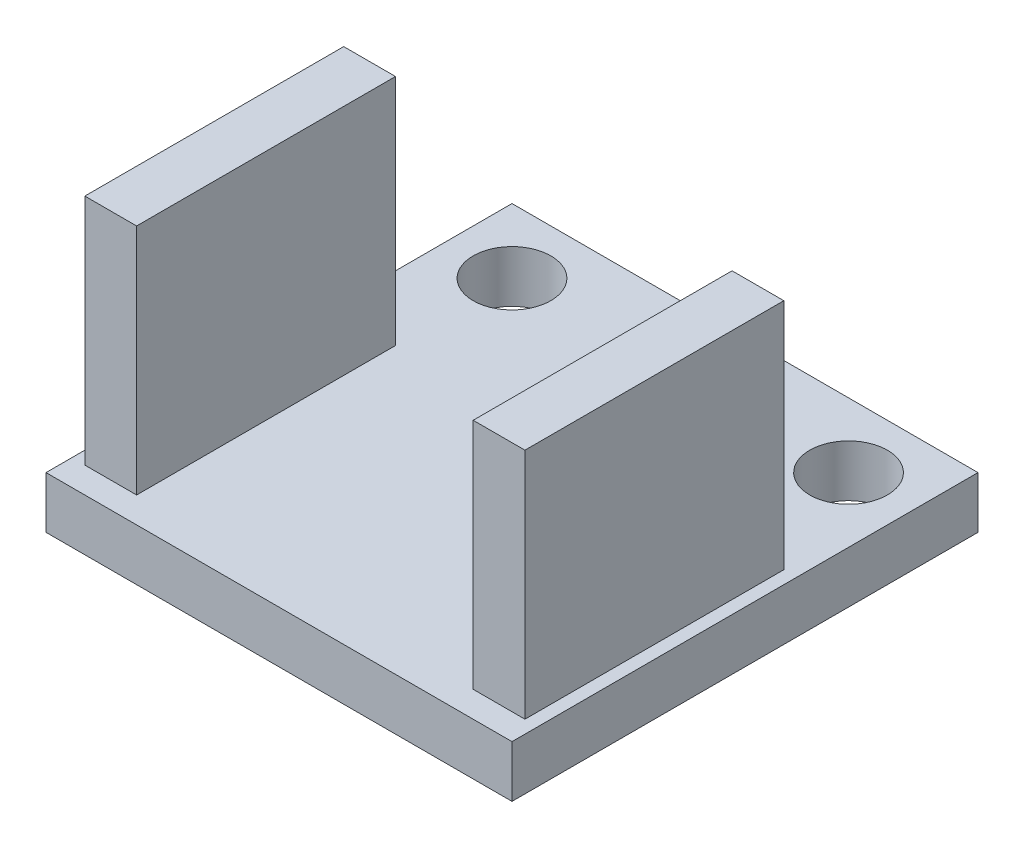
ISO-10303-21;
HEADER;
FILE_DESCRIPTION(('STEP AP214'),'2;1');
FILE_NAME('part.step','',(''),(''),'','','');
FILE_SCHEMA(('AUTOMOTIVE_DESIGN { 1 0 10303 214 1 1 1 1 }'));
ENDSEC;
DATA;
#1=APPLICATION_CONTEXT('core data for automotive mechanical design processes');
#2=APPLICATION_PROTOCOL_DEFINITION('international standard','automotive_design',2000,#1);
#3=PRODUCT_CONTEXT('',#1,'mechanical');
#4=PRODUCT('Part','Part','',(#3));
#5=PRODUCT_RELATED_PRODUCT_CATEGORY('part','',(#4));
#6=PRODUCT_DEFINITION_FORMATION('','',#4);
#7=PRODUCT_DEFINITION_CONTEXT('part definition',#1,'design');
#8=PRODUCT_DEFINITION('design','',#6,#7);
#9=PRODUCT_DEFINITION_SHAPE('','',#8);
#10=(LENGTH_UNIT() NAMED_UNIT(*) SI_UNIT(.MILLI.,.METRE.));
#11=(NAMED_UNIT(*) PLANE_ANGLE_UNIT() SI_UNIT($,.RADIAN.));
#12=(NAMED_UNIT(*) SI_UNIT($,.STERADIAN.) SOLID_ANGLE_UNIT());
#13=UNCERTAINTY_MEASURE_WITH_UNIT(LENGTH_MEASURE(1.E-05),#10,'distance_accuracy_value','');
#14=(GEOMETRIC_REPRESENTATION_CONTEXT(3) GLOBAL_UNCERTAINTY_ASSIGNED_CONTEXT((#13)) GLOBAL_UNIT_ASSIGNED_CONTEXT((#10,
#11,#12)) REPRESENTATION_CONTEXT('',''));
#15=CARTESIAN_POINT('',(0.,0.,0.));
#16=DIRECTION('',(0.,0.,1.));
#17=DIRECTION('',(1.,0.,0.));
#18=AXIS2_PLACEMENT_3D('',#15,#16,#17);
#19=CARTESIAN_POINT('',(0.,2.,0.));
#20=DIRECTION('',(0.,1.,0.));
#21=DIRECTION('',(0.,0.,1.));
#22=AXIS2_PLACEMENT_3D('',#19,#20,#21);
#23=PLANE('',#22);
#24=CARTESIAN_POINT('',(2.5,2.,2.5));
#25=DIRECTION('',(0.,1.,0.));
#26=DIRECTION('',(0.,0.,1.));
#27=AXIS2_PLACEMENT_3D('',#24,#25,#26);
#28=CIRCLE('',#27,1.5);
#29=CARTESIAN_POINT('',(2.5,2.,4.));
#30=VERTEX_POINT('',#29);
#31=EDGE_CURVE('E208',#30,#30,#28,.T.);
#32=ORIENTED_EDGE('',*,*,#31,.F.);
#33=EDGE_LOOP('',(#32));
#34=FACE_BOUND('',#33,.T.);
#35=CARTESIAN_POINT('',(15.5,2.,2.5));
#36=DIRECTION('',(0.,1.,0.));
#37=DIRECTION('',(0.,0.,1.));
#38=AXIS2_PLACEMENT_3D('',#35,#36,#37);
#39=CIRCLE('',#38,1.5);
#40=CARTESIAN_POINT('',(15.5,2.,4.));
#41=VERTEX_POINT('',#40);
#42=EDGE_CURVE('E202',#41,#41,#39,.T.);
#43=ORIENTED_EDGE('',*,*,#42,.F.);
#44=EDGE_LOOP('',(#43));
#45=FACE_BOUND('',#44,.T.);
#46=DIRECTION('',(0.,0.,1.));
#47=VECTOR('',#46,1.);
#48=CARTESIAN_POINT('',(0.,2.,0.));
#49=LINE('',#48,#47);
#50=CARTESIAN_POINT('',(0.,2.,0.));
#51=VERTEX_POINT('',#50);
#52=CARTESIAN_POINT('',(0.,2.,18.));
#53=VERTEX_POINT('',#52);
#54=EDGE_CURVE('E219',#51,#53,#49,.T.);
#55=ORIENTED_EDGE('',*,*,#54,.T.);
#56=DIRECTION('',(1.,0.,0.));
#57=VECTOR('',#56,1.);
#58=CARTESIAN_POINT('',(0.,2.,18.));
#59=LINE('',#58,#57);
#60=CARTESIAN_POINT('',(18.,2.,18.));
#61=VERTEX_POINT('',#60);
#62=EDGE_CURVE('E223',#53,#61,#59,.T.);
#63=ORIENTED_EDGE('',*,*,#62,.T.);
#64=DIRECTION('',(0.,0.,-1.));
#65=VECTOR('',#64,1.);
#66=CARTESIAN_POINT('',(18.,2.,0.));
#67=LINE('',#66,#65);
#68=CARTESIAN_POINT('',(18.,2.,0.));
#69=VERTEX_POINT('',#68);
#70=EDGE_CURVE('E227',#61,#69,#67,.T.);
#71=ORIENTED_EDGE('',*,*,#70,.T.);
#72=DIRECTION('',(-1.,0.,0.));
#73=VECTOR('',#72,1.);
#74=CARTESIAN_POINT('',(0.,2.,0.));
#75=LINE('',#74,#73);
#76=EDGE_CURVE('E230',#69,#51,#75,.T.);
#77=ORIENTED_EDGE('',*,*,#76,.T.);
#78=EDGE_LOOP('',(#55,#63,#71,#77));
#79=FACE_BOUND('',#78,.T.);
#80=DIRECTION('',(1.,0.,0.));
#81=VECTOR('',#80,1.);
#82=CARTESIAN_POINT('',(0.500000000000001,2.,17.));
#83=LINE('',#82,#81);
#84=CARTESIAN_POINT('',(0.500000000000001,2.,17.));
#85=VERTEX_POINT('',#84);
#86=CARTESIAN_POINT('',(2.5,2.,17.));
#87=VERTEX_POINT('',#86);
#88=EDGE_CURVE('E163',#85,#87,#83,.T.);
#89=ORIENTED_EDGE('',*,*,#88,.F.);
#90=DIRECTION('',(0.,0.,1.));
#91=VECTOR('',#90,1.);
#92=CARTESIAN_POINT('',(0.500000000000011,2.,6.99999999999999));
#93=LINE('',#92,#91);
#94=CARTESIAN_POINT('',(0.500000000000011,2.,6.99999999999999));
#95=VERTEX_POINT('',#94);
#96=EDGE_CURVE('E158',#95,#85,#93,.T.);
#97=ORIENTED_EDGE('',*,*,#96,.F.);
#98=DIRECTION('',(-1.,0.,0.));
#99=VECTOR('',#98,1.);
#100=CARTESIAN_POINT('',(0.500000000000011,2.,6.99999999999999));
#101=LINE('',#100,#99);
#102=CARTESIAN_POINT('',(2.50000000000001,2.,6.99999999999999));
#103=VERTEX_POINT('',#102);
#104=EDGE_CURVE('E173',#103,#95,#101,.T.);
#105=ORIENTED_EDGE('',*,*,#104,.F.);
#106=DIRECTION('',(0.,0.,-1.));
#107=VECTOR('',#106,1.);
#108=CARTESIAN_POINT('',(2.50000000000001,2.,6.99999999999999));
#109=LINE('',#108,#107);
#110=EDGE_CURVE('E185',#87,#103,#109,.T.);
#111=ORIENTED_EDGE('',*,*,#110,.F.);
#112=EDGE_LOOP('',(#89,#97,#105,#111));
#113=FACE_BOUND('',#112,.T.);
#114=DIRECTION('',(1.,0.,0.));
#115=VECTOR('',#114,1.);
#116=CARTESIAN_POINT('',(15.5,2.,17.));
#117=LINE('',#116,#115);
#118=CARTESIAN_POINT('',(15.5,2.,17.));
#119=VERTEX_POINT('',#118);
#120=CARTESIAN_POINT('',(17.5,2.,17.));
#121=VERTEX_POINT('',#120);
#122=EDGE_CURVE('E425',#119,#121,#117,.T.);
#123=ORIENTED_EDGE('',*,*,#122,.F.);
#124=DIRECTION('',(0.,0.,1.));
#125=VECTOR('',#124,1.);
#126=CARTESIAN_POINT('',(15.5,2.,7.));
#127=LINE('',#126,#125);
#128=CARTESIAN_POINT('',(15.5,2.,7.));
#129=VERTEX_POINT('',#128);
#130=EDGE_CURVE('E155',#129,#119,#127,.T.);
#131=ORIENTED_EDGE('',*,*,#130,.F.);
#132=DIRECTION('',(-1.,0.,0.));
#133=VECTOR('',#132,1.);
#134=CARTESIAN_POINT('',(15.5,2.,7.));
#135=LINE('',#134,#133);
#136=CARTESIAN_POINT('',(17.5,2.,7.));
#137=VERTEX_POINT('',#136);
#138=EDGE_CURVE('E151',#137,#129,#135,.T.);
#139=ORIENTED_EDGE('',*,*,#138,.F.);
#140=DIRECTION('',(0.,0.,-1.));
#141=VECTOR('',#140,1.);
#142=CARTESIAN_POINT('',(17.5,2.,7.));
#143=LINE('',#142,#141);
#144=EDGE_CURVE('E421',#121,#137,#143,.T.);
#145=ORIENTED_EDGE('',*,*,#144,.F.);
#146=EDGE_LOOP('',(#123,#131,#139,#145));
#147=FACE_BOUND('',#146,.T.);
#148=ADVANCED_FACE('F39',(#34,#45,#79,#113,#147),#23,.T.);
#149=CARTESIAN_POINT('',(0.,2.,0.));
#150=DIRECTION('',(1.,0.,0.));
#151=DIRECTION('',(0.,0.,-1.));
#152=AXIS2_PLACEMENT_3D('',#149,#150,#151);
#153=PLANE('',#152);
#154=DIRECTION('',(0.,0.,1.));
#155=VECTOR('',#154,1.);
#156=CARTESIAN_POINT('',(0.,0.,0.));
#157=LINE('',#156,#155);
#158=CARTESIAN_POINT('',(0.,0.,0.));
#159=VERTEX_POINT('',#158);
#160=CARTESIAN_POINT('',(0.,0.,18.));
#161=VERTEX_POINT('',#160);
#162=EDGE_CURVE('E207',#159,#161,#157,.T.);
#163=ORIENTED_EDGE('',*,*,#162,.T.);
#164=DIRECTION('',(0.,-1.,0.));
#165=VECTOR('',#164,1.);
#166=CARTESIAN_POINT('',(0.,2.,18.));
#167=LINE('',#166,#165);
#168=EDGE_CURVE('E11',#53,#161,#167,.T.);
#169=ORIENTED_EDGE('',*,*,#168,.F.);
#170=ORIENTED_EDGE('',*,*,#54,.F.);
#171=DIRECTION('',(0.,-1.,0.));
#172=VECTOR('',#171,1.);
#173=CARTESIAN_POINT('',(0.,2.,0.));
#174=LINE('',#173,#172);
#175=EDGE_CURVE('E233',#51,#159,#174,.T.);
#176=ORIENTED_EDGE('',*,*,#175,.T.);
#177=EDGE_LOOP('',(#163,#169,#170,#176));
#178=FACE_BOUND('',#177,.T.);
#179=ADVANCED_FACE('F41',(#178),#153,.F.);
#180=CARTESIAN_POINT('',(0.,2.,18.));
#181=DIRECTION('',(0.,0.,-1.));
#182=DIRECTION('',(-1.,0.,0.));
#183=AXIS2_PLACEMENT_3D('',#180,#181,#182);
#184=PLANE('',#183);
#185=DIRECTION('',(1.,0.,0.));
#186=VECTOR('',#185,1.);
#187=CARTESIAN_POINT('',(0.,0.,18.));
#188=LINE('',#187,#186);
#189=CARTESIAN_POINT('',(18.,0.,18.));
#190=VERTEX_POINT('',#189);
#191=EDGE_CURVE('E237',#161,#190,#188,.T.);
#192=ORIENTED_EDGE('',*,*,#191,.T.);
#193=DIRECTION('',(0.,-1.,0.));
#194=VECTOR('',#193,1.);
#195=CARTESIAN_POINT('',(18.,2.,18.));
#196=LINE('',#195,#194);
#197=EDGE_CURVE('E48',#61,#190,#196,.T.);
#198=ORIENTED_EDGE('',*,*,#197,.F.);
#199=ORIENTED_EDGE('',*,*,#62,.F.);
#200=ORIENTED_EDGE('',*,*,#168,.T.);
#201=EDGE_LOOP('',(#192,#198,#199,#200));
#202=FACE_BOUND('',#201,.T.);
#203=ADVANCED_FACE('F273',(#202),#184,.F.);
#204=CARTESIAN_POINT('',(18.,2.,0.));
#205=DIRECTION('',(-1.,0.,0.));
#206=DIRECTION('',(0.,0.,1.));
#207=AXIS2_PLACEMENT_3D('',#204,#205,#206);
#208=PLANE('',#207);
#209=DIRECTION('',(0.,0.,-1.));
#210=VECTOR('',#209,1.);
#211=CARTESIAN_POINT('',(18.,0.,0.));
#212=LINE('',#211,#210);
#213=CARTESIAN_POINT('',(18.,0.,0.));
#214=VERTEX_POINT('',#213);
#215=EDGE_CURVE('E240',#190,#214,#212,.T.);
#216=ORIENTED_EDGE('',*,*,#215,.T.);
#217=DIRECTION('',(0.,-1.,0.));
#218=VECTOR('',#217,1.);
#219=CARTESIAN_POINT('',(18.,2.,0.));
#220=LINE('',#219,#218);
#221=EDGE_CURVE('E248',#69,#214,#220,.T.);
#222=ORIENTED_EDGE('',*,*,#221,.F.);
#223=ORIENTED_EDGE('',*,*,#70,.F.);
#224=ORIENTED_EDGE('',*,*,#197,.T.);
#225=EDGE_LOOP('',(#216,#222,#223,#224));
#226=FACE_BOUND('',#225,.T.);
#227=ADVANCED_FACE('F257',(#226),#208,.F.);
#228=CARTESIAN_POINT('',(0.,2.,0.));
#229=DIRECTION('',(0.,0.,1.));
#230=DIRECTION('',(1.,0.,0.));
#231=AXIS2_PLACEMENT_3D('',#228,#229,#230);
#232=PLANE('',#231);
#233=DIRECTION('',(-1.,0.,0.));
#234=VECTOR('',#233,1.);
#235=CARTESIAN_POINT('',(0.,0.,0.));
#236=LINE('',#235,#234);
#237=EDGE_CURVE('E224',#214,#159,#236,.T.);
#238=ORIENTED_EDGE('',*,*,#237,.T.);
#239=ORIENTED_EDGE('',*,*,#175,.F.);
#240=ORIENTED_EDGE('',*,*,#76,.F.);
#241=ORIENTED_EDGE('',*,*,#221,.T.);
#242=EDGE_LOOP('',(#238,#239,#240,#241));
#243=FACE_BOUND('',#242,.T.);
#244=ADVANCED_FACE('F266',(#243),#232,.F.);
#245=CARTESIAN_POINT('',(0.,0.,0.));
#246=DIRECTION('',(0.,1.,0.));
#247=DIRECTION('',(0.,0.,1.));
#248=AXIS2_PLACEMENT_3D('',#245,#246,#247);
#249=PLANE('',#248);
#250=CARTESIAN_POINT('',(2.5,0.,2.5));
#251=DIRECTION('',(0.,1.,0.));
#252=DIRECTION('',(0.,0.,1.));
#253=AXIS2_PLACEMENT_3D('',#250,#251,#252);
#254=CIRCLE('',#253,1.5);
#255=CARTESIAN_POINT('',(2.5,0.,4.));
#256=VERTEX_POINT('',#255);
#257=EDGE_CURVE('E203',#256,#256,#254,.T.);
#258=ORIENTED_EDGE('',*,*,#257,.T.);
#259=EDGE_LOOP('',(#258));
#260=FACE_BOUND('',#259,.T.);
#261=CARTESIAN_POINT('',(15.5,0.,2.5));
#262=DIRECTION('',(0.,1.,0.));
#263=DIRECTION('',(0.,0.,1.));
#264=AXIS2_PLACEMENT_3D('',#261,#262,#263);
#265=CIRCLE('',#264,1.5);
#266=CARTESIAN_POINT('',(15.5,0.,4.));
#267=VERTEX_POINT('',#266);
#268=EDGE_CURVE('E212',#267,#267,#265,.T.);
#269=ORIENTED_EDGE('',*,*,#268,.T.);
#270=EDGE_LOOP('',(#269));
#271=FACE_BOUND('',#270,.T.);
#272=ORIENTED_EDGE('',*,*,#162,.F.);
#273=ORIENTED_EDGE('',*,*,#237,.F.);
#274=ORIENTED_EDGE('',*,*,#215,.F.);
#275=ORIENTED_EDGE('',*,*,#191,.F.);
#276=EDGE_LOOP('',(#272,#273,#274,#275));
#277=FACE_BOUND('',#276,.T.);
#278=ADVANCED_FACE('F263',(#260,#271,#277),#249,.F.);
#279=CARTESIAN_POINT('',(15.5,0.,2.5));
#280=DIRECTION('',(0.,1.,0.));
#281=DIRECTION('',(0.,0.,1.));
#282=AXIS2_PLACEMENT_3D('',#279,#280,#281);
#283=CYLINDRICAL_SURFACE('',#282,1.5);
#284=ORIENTED_EDGE('',*,*,#268,.F.);
#285=EDGE_LOOP('',(#284));
#286=FACE_BOUND('',#285,.T.);
#287=ORIENTED_EDGE('',*,*,#42,.T.);
#288=EDGE_LOOP('',(#287));
#289=FACE_BOUND('',#288,.T.);
#290=ADVANCED_FACE('F291',(#286,#289),#283,.F.);
#291=CARTESIAN_POINT('',(2.5,0.,2.5));
#292=DIRECTION('',(0.,1.,0.));
#293=DIRECTION('',(0.,0.,1.));
#294=AXIS2_PLACEMENT_3D('',#291,#292,#293);
#295=CYLINDRICAL_SURFACE('',#294,1.5);
#296=ORIENTED_EDGE('',*,*,#257,.F.);
#297=EDGE_LOOP('',(#296));
#298=FACE_BOUND('',#297,.T.);
#299=ORIENTED_EDGE('',*,*,#31,.T.);
#300=EDGE_LOOP('',(#299));
#301=FACE_BOUND('',#300,.T.);
#302=ADVANCED_FACE('F320',(#298,#301),#295,.F.);
#303=CARTESIAN_POINT('',(0.500000000000011,11.,6.99999999999999));
#304=DIRECTION('',(1.,0.,0.));
#305=DIRECTION('',(0.,0.,-1.));
#306=AXIS2_PLACEMENT_3D('',#303,#304,#305);
#307=PLANE('',#306);
#308=ORIENTED_EDGE('',*,*,#96,.T.);
#309=DIRECTION('',(0.,-1.,0.));
#310=VECTOR('',#309,1.);
#311=CARTESIAN_POINT('',(0.500000000000001,11.,17.));
#312=LINE('',#311,#310);
#313=CARTESIAN_POINT('',(0.500000000000001,11.,17.));
#314=VERTEX_POINT('',#313);
#315=EDGE_CURVE('E199',#314,#85,#312,.T.);
#316=ORIENTED_EDGE('',*,*,#315,.F.);
#317=DIRECTION('',(0.,0.,1.));
#318=VECTOR('',#317,1.);
#319=CARTESIAN_POINT('',(0.500000000000011,11.,6.99999999999999));
#320=LINE('',#319,#318);
#321=CARTESIAN_POINT('',(0.500000000000011,11.,6.99999999999999));
#322=VERTEX_POINT('',#321);
#323=EDGE_CURVE('E168',#322,#314,#320,.T.);
#324=ORIENTED_EDGE('',*,*,#323,.F.);
#325=DIRECTION('',(0.,-1.,0.));
#326=VECTOR('',#325,1.);
#327=CARTESIAN_POINT('',(0.500000000000011,11.,6.99999999999999));
#328=LINE('',#327,#326);
#329=EDGE_CURVE('E181',#322,#95,#328,.T.);
#330=ORIENTED_EDGE('',*,*,#329,.T.);
#331=EDGE_LOOP('',(#308,#316,#324,#330));
#332=FACE_BOUND('',#331,.T.);
#333=ADVANCED_FACE('F325',(#332),#307,.F.);
#334=CARTESIAN_POINT('',(0.500000000000001,11.,17.));
#335=DIRECTION('',(0.,0.,-1.));
#336=DIRECTION('',(-1.,0.,0.));
#337=AXIS2_PLACEMENT_3D('',#334,#335,#336);
#338=PLANE('',#337);
#339=ORIENTED_EDGE('',*,*,#88,.T.);
#340=DIRECTION('',(0.,-1.,0.));
#341=VECTOR('',#340,1.);
#342=CARTESIAN_POINT('',(2.5,11.,17.));
#343=LINE('',#342,#341);
#344=CARTESIAN_POINT('',(2.5,11.,17.));
#345=VERTEX_POINT('',#344);
#346=EDGE_CURVE('E195',#345,#87,#343,.T.);
#347=ORIENTED_EDGE('',*,*,#346,.F.);
#348=DIRECTION('',(1.,0.,0.));
#349=VECTOR('',#348,1.);
#350=CARTESIAN_POINT('',(0.500000000000001,11.,17.));
#351=LINE('',#350,#349);
#352=EDGE_CURVE('E172',#314,#345,#351,.T.);
#353=ORIENTED_EDGE('',*,*,#352,.F.);
#354=ORIENTED_EDGE('',*,*,#315,.T.);
#355=EDGE_LOOP('',(#339,#347,#353,#354));
#356=FACE_BOUND('',#355,.T.);
#357=ADVANCED_FACE('F330',(#356),#338,.F.);
#358=CARTESIAN_POINT('',(2.50000000000001,11.,6.99999999999999));
#359=DIRECTION('',(-1.,0.,0.));
#360=DIRECTION('',(0.,0.,1.));
#361=AXIS2_PLACEMENT_3D('',#358,#359,#360);
#362=PLANE('',#361);
#363=ORIENTED_EDGE('',*,*,#110,.T.);
#364=DIRECTION('',(0.,-1.,0.));
#365=VECTOR('',#364,1.);
#366=CARTESIAN_POINT('',(2.50000000000001,11.,6.99999999999999));
#367=LINE('',#366,#365);
#368=CARTESIAN_POINT('',(2.50000000000001,11.,6.99999999999999));
#369=VERTEX_POINT('',#368);
#370=EDGE_CURVE('E63',#369,#103,#367,.T.);
#371=ORIENTED_EDGE('',*,*,#370,.F.);
#372=DIRECTION('',(0.,0.,-1.));
#373=VECTOR('',#372,1.);
#374=CARTESIAN_POINT('',(2.50000000000001,11.,6.99999999999999));
#375=LINE('',#374,#373);
#376=EDGE_CURVE('E176',#345,#369,#375,.T.);
#377=ORIENTED_EDGE('',*,*,#376,.F.);
#378=ORIENTED_EDGE('',*,*,#346,.T.);
#379=EDGE_LOOP('',(#363,#371,#377,#378));
#380=FACE_BOUND('',#379,.T.);
#381=ADVANCED_FACE('F337',(#380),#362,.F.);
#382=CARTESIAN_POINT('',(0.500000000000011,11.,6.99999999999999));
#383=DIRECTION('',(0.,0.,1.));
#384=DIRECTION('',(1.,0.,0.));
#385=AXIS2_PLACEMENT_3D('',#382,#383,#384);
#386=PLANE('',#385);
#387=ORIENTED_EDGE('',*,*,#104,.T.);
#388=ORIENTED_EDGE('',*,*,#329,.F.);
#389=DIRECTION('',(-1.,0.,0.));
#390=VECTOR('',#389,1.);
#391=CARTESIAN_POINT('',(0.500000000000011,11.,6.99999999999999));
#392=LINE('',#391,#390);
#393=EDGE_CURVE('E179',#369,#322,#392,.T.);
#394=ORIENTED_EDGE('',*,*,#393,.F.);
#395=ORIENTED_EDGE('',*,*,#370,.T.);
#396=EDGE_LOOP('',(#387,#388,#394,#395));
#397=FACE_BOUND('',#396,.T.);
#398=ADVANCED_FACE('F345',(#397),#386,.F.);
#399=CARTESIAN_POINT('',(0.,11.,0.));
#400=DIRECTION('',(0.,1.,0.));
#401=DIRECTION('',(0.,0.,1.));
#402=AXIS2_PLACEMENT_3D('',#399,#400,#401);
#403=PLANE('',#402);
#404=ORIENTED_EDGE('',*,*,#323,.T.);
#405=ORIENTED_EDGE('',*,*,#352,.T.);
#406=ORIENTED_EDGE('',*,*,#376,.T.);
#407=ORIENTED_EDGE('',*,*,#393,.T.);
#408=EDGE_LOOP('',(#404,#405,#406,#407));
#409=FACE_BOUND('',#408,.T.);
#410=ADVANCED_FACE('F353',(#409),#403,.T.);
#411=CARTESIAN_POINT('',(15.5,11.,7.));
#412=DIRECTION('',(1.,0.,0.));
#413=DIRECTION('',(0.,0.,-1.));
#414=AXIS2_PLACEMENT_3D('',#411,#412,#413);
#415=PLANE('',#414);
#416=ORIENTED_EDGE('',*,*,#130,.T.);
#417=DIRECTION('',(0.,-1.,0.));
#418=VECTOR('',#417,1.);
#419=CARTESIAN_POINT('',(15.5,11.,17.));
#420=LINE('',#419,#418);
#421=CARTESIAN_POINT('',(15.5,11.,17.));
#422=VERTEX_POINT('',#421);
#423=EDGE_CURVE('E134',#422,#119,#420,.T.);
#424=ORIENTED_EDGE('',*,*,#423,.F.);
#425=DIRECTION('',(0.,0.,1.));
#426=VECTOR('',#425,1.);
#427=CARTESIAN_POINT('',(15.5,11.,7.));
#428=LINE('',#427,#426);
#429=CARTESIAN_POINT('',(15.5,11.,7.));
#430=VERTEX_POINT('',#429);
#431=EDGE_CURVE('E142',#430,#422,#428,.T.);
#432=ORIENTED_EDGE('',*,*,#431,.F.);
#433=DIRECTION('',(0.,-1.,0.));
#434=VECTOR('',#433,1.);
#435=CARTESIAN_POINT('',(15.5,11.,7.));
#436=LINE('',#435,#434);
#437=EDGE_CURVE('E417',#430,#129,#436,.T.);
#438=ORIENTED_EDGE('',*,*,#437,.T.);
#439=EDGE_LOOP('',(#416,#424,#432,#438));
#440=FACE_BOUND('',#439,.T.);
#441=ADVANCED_FACE('F153',(#440),#415,.F.);
#442=CARTESIAN_POINT('',(15.5,11.,17.));
#443=DIRECTION('',(0.,0.,-1.));
#444=DIRECTION('',(-1.,0.,0.));
#445=AXIS2_PLACEMENT_3D('',#442,#443,#444);
#446=PLANE('',#445);
#447=ORIENTED_EDGE('',*,*,#122,.T.);
#448=DIRECTION('',(0.,-1.,0.));
#449=VECTOR('',#448,1.);
#450=CARTESIAN_POINT('',(17.5,11.,17.));
#451=LINE('',#450,#449);
#452=CARTESIAN_POINT('',(17.5,11.,17.));
#453=VERTEX_POINT('',#452);
#454=EDGE_CURVE('E137',#453,#121,#451,.T.);
#455=ORIENTED_EDGE('',*,*,#454,.F.);
#456=DIRECTION('',(1.,0.,0.));
#457=VECTOR('',#456,1.);
#458=CARTESIAN_POINT('',(15.5,11.,17.));
#459=LINE('',#458,#457);
#460=EDGE_CURVE('E130',#422,#453,#459,.T.);
#461=ORIENTED_EDGE('',*,*,#460,.F.);
#462=ORIENTED_EDGE('',*,*,#423,.T.);
#463=EDGE_LOOP('',(#447,#455,#461,#462));
#464=FACE_BOUND('',#463,.T.);
#465=ADVANCED_FACE('F132',(#464),#446,.F.);
#466=CARTESIAN_POINT('',(17.5,11.,7.));
#467=DIRECTION('',(-1.,0.,0.));
#468=DIRECTION('',(0.,0.,1.));
#469=AXIS2_PLACEMENT_3D('',#466,#467,#468);
#470=PLANE('',#469);
#471=ORIENTED_EDGE('',*,*,#144,.T.);
#472=DIRECTION('',(0.,-1.,0.));
#473=VECTOR('',#472,1.);
#474=CARTESIAN_POINT('',(17.5,11.,7.));
#475=LINE('',#474,#473);
#476=CARTESIAN_POINT('',(17.5,11.,7.));
#477=VERTEX_POINT('',#476);
#478=EDGE_CURVE('E55',#477,#137,#475,.T.);
#479=ORIENTED_EDGE('',*,*,#478,.F.);
#480=DIRECTION('',(0.,0.,-1.));
#481=VECTOR('',#480,1.);
#482=CARTESIAN_POINT('',(17.5,11.,7.));
#483=LINE('',#482,#481);
#484=EDGE_CURVE('E141',#453,#477,#483,.T.);
#485=ORIENTED_EDGE('',*,*,#484,.F.);
#486=ORIENTED_EDGE('',*,*,#454,.T.);
#487=EDGE_LOOP('',(#471,#479,#485,#486));
#488=FACE_BOUND('',#487,.T.);
#489=ADVANCED_FACE('F373',(#488),#470,.F.);
#490=CARTESIAN_POINT('',(15.5,11.,7.));
#491=DIRECTION('',(0.,0.,1.));
#492=DIRECTION('',(1.,0.,0.));
#493=AXIS2_PLACEMENT_3D('',#490,#491,#492);
#494=PLANE('',#493);
#495=ORIENTED_EDGE('',*,*,#138,.T.);
#496=ORIENTED_EDGE('',*,*,#437,.F.);
#497=DIRECTION('',(-1.,0.,0.));
#498=VECTOR('',#497,1.);
#499=CARTESIAN_POINT('',(15.5,11.,7.));
#500=LINE('',#499,#498);
#501=EDGE_CURVE('E146',#477,#430,#500,.T.);
#502=ORIENTED_EDGE('',*,*,#501,.F.);
#503=ORIENTED_EDGE('',*,*,#478,.T.);
#504=EDGE_LOOP('',(#495,#496,#502,#503));
#505=FACE_BOUND('',#504,.T.);
#506=ADVANCED_FACE('F380',(#505),#494,.F.);
#507=CARTESIAN_POINT('',(0.,11.,0.));
#508=DIRECTION('',(0.,1.,0.));
#509=DIRECTION('',(0.,0.,1.));
#510=AXIS2_PLACEMENT_3D('',#507,#508,#509);
#511=PLANE('',#510);
#512=ORIENTED_EDGE('',*,*,#431,.T.);
#513=ORIENTED_EDGE('',*,*,#460,.T.);
#514=ORIENTED_EDGE('',*,*,#484,.T.);
#515=ORIENTED_EDGE('',*,*,#501,.T.);
#516=EDGE_LOOP('',(#512,#513,#514,#515));
#517=FACE_BOUND('',#516,.T.);
#518=ADVANCED_FACE('F145',(#517),#511,.T.);
#519=CLOSED_SHELL('',(#148,#179,#203,#227,#244,#278,#290,#302,#333,#357,#381,#398,#410,#441,
#465,#489,#506,#518));
#520=MANIFOLD_SOLID_BREP('B2',#519);
#521=ADVANCED_BREP_SHAPE_REPRESENTATION('',(#18,#520),#14);
#522=SHAPE_DEFINITION_REPRESENTATION(#9,#521);
ENDSEC;
END-ISO-10303-21;
